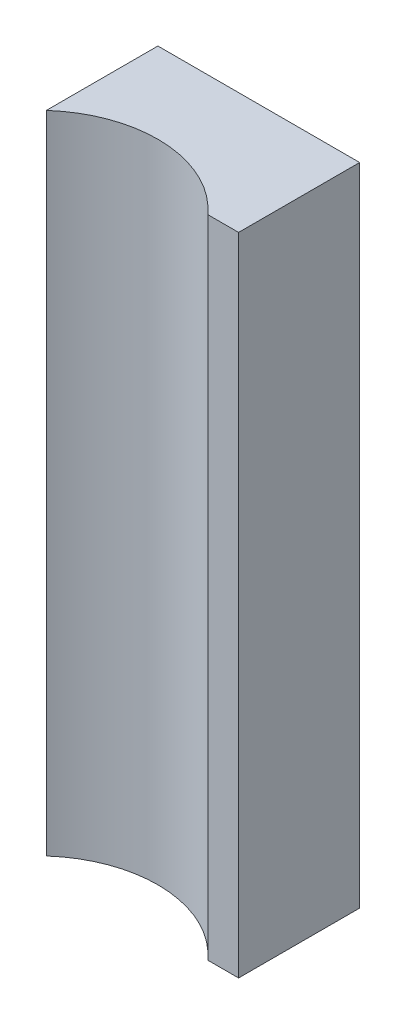
ISO-10303-21;
HEADER;
FILE_DESCRIPTION(('STEP AP214'),'2;1');
FILE_NAME('part.step','',(''),(''),'','','');
FILE_SCHEMA(('AUTOMOTIVE_DESIGN { 1 0 10303 214 1 1 1 1 }'));
ENDSEC;
DATA;
#1=APPLICATION_CONTEXT('core data for automotive mechanical design processes');
#2=APPLICATION_PROTOCOL_DEFINITION('international standard','automotive_design',2000,#1);
#3=PRODUCT_CONTEXT('',#1,'mechanical');
#4=PRODUCT('Part','Part','',(#3));
#5=PRODUCT_RELATED_PRODUCT_CATEGORY('part','',(#4));
#6=PRODUCT_DEFINITION_FORMATION('','',#4);
#7=PRODUCT_DEFINITION_CONTEXT('part definition',#1,'design');
#8=PRODUCT_DEFINITION('design','',#6,#7);
#9=PRODUCT_DEFINITION_SHAPE('','',#8);
#10=(LENGTH_UNIT() NAMED_UNIT(*) SI_UNIT(.MILLI.,.METRE.));
#11=(NAMED_UNIT(*) PLANE_ANGLE_UNIT() SI_UNIT($,.RADIAN.));
#12=(NAMED_UNIT(*) SI_UNIT($,.STERADIAN.) SOLID_ANGLE_UNIT());
#13=UNCERTAINTY_MEASURE_WITH_UNIT(LENGTH_MEASURE(1.E-05),#10,'distance_accuracy_value','');
#14=(GEOMETRIC_REPRESENTATION_CONTEXT(3) GLOBAL_UNCERTAINTY_ASSIGNED_CONTEXT((#13)) GLOBAL_UNIT_ASSIGNED_CONTEXT((#10,
#11,#12)) REPRESENTATION_CONTEXT('',''));
#15=CARTESIAN_POINT('',(0.,0.,0.));
#16=DIRECTION('',(0.,0.,1.));
#17=DIRECTION('',(1.,0.,0.));
#18=AXIS2_PLACEMENT_3D('',#15,#16,#17);
#19=CARTESIAN_POINT('',(19.05,101.6,-31.75));
#20=DIRECTION('',(0.,0.,1.));
#21=DIRECTION('',(1.,0.,0.));
#22=AXIS2_PLACEMENT_3D('',#19,#20,#21);
#23=PLANE('',#22);
#24=DIRECTION('',(-1.,0.,0.));
#25=VECTOR('',#24,1.);
#26=CARTESIAN_POINT('',(19.05,0.,-31.75));
#27=LINE('',#26,#25);
#28=CARTESIAN_POINT('',(19.05,0.,-31.75));
#29=VERTEX_POINT('',#28);
#30=CARTESIAN_POINT('',(-12.7,0.,-31.75));
#31=VERTEX_POINT('',#30);
#32=EDGE_CURVE('E127',#29,#31,#27,.T.);
#33=ORIENTED_EDGE('',*,*,#32,.T.);
#34=DIRECTION('',(0.,-1.,0.));
#35=VECTOR('',#34,1.);
#36=CARTESIAN_POINT('',(-12.7,101.6,-31.75));
#37=LINE('',#36,#35);
#38=CARTESIAN_POINT('',(-12.7,101.6,-31.75));
#39=VERTEX_POINT('',#38);
#40=EDGE_CURVE('E11',#39,#31,#37,.T.);
#41=ORIENTED_EDGE('',*,*,#40,.F.);
#42=DIRECTION('',(-1.,0.,0.));
#43=VECTOR('',#42,1.);
#44=CARTESIAN_POINT('',(19.05,101.6,-31.75));
#45=LINE('',#44,#43);
#46=CARTESIAN_POINT('',(19.05,101.6,-31.75));
#47=VERTEX_POINT('',#46);
#48=EDGE_CURVE('E139',#47,#39,#45,.T.);
#49=ORIENTED_EDGE('',*,*,#48,.F.);
#50=DIRECTION('',(0.,-1.,0.));
#51=VECTOR('',#50,1.);
#52=CARTESIAN_POINT('',(19.05,101.6,-31.75));
#53=LINE('',#52,#51);
#54=EDGE_CURVE('E123',#47,#29,#53,.T.);
#55=ORIENTED_EDGE('',*,*,#54,.T.);
#56=EDGE_LOOP('',(#33,#41,#49,#55));
#57=FACE_BOUND('',#56,.T.);
#58=ADVANCED_FACE('F39',(#57),#23,.F.);
#59=CARTESIAN_POINT('',(-12.7,101.6,-31.75));
#60=DIRECTION('',(1.,0.,0.));
#61=DIRECTION('',(0.,0.,-1.));
#62=AXIS2_PLACEMENT_3D('',#59,#60,#61);
#63=PLANE('',#62);
#64=DIRECTION('',(0.,0.,1.));
#65=VECTOR('',#64,1.);
#66=CARTESIAN_POINT('',(-12.7,0.,-31.75));
#67=LINE('',#66,#65);
#68=CARTESIAN_POINT('',(-12.7,0.,-14.1990316571237));
#69=VERTEX_POINT('',#68);
#70=EDGE_CURVE('E131',#31,#69,#67,.T.);
#71=ORIENTED_EDGE('',*,*,#70,.T.);
#72=DIRECTION('',(0.,-1.,0.));
#73=VECTOR('',#72,1.);
#74=CARTESIAN_POINT('',(-12.7,101.6,-14.1990316571237));
#75=LINE('',#74,#73);
#76=CARTESIAN_POINT('',(-12.7,101.6,-14.1990316571237));
#77=VERTEX_POINT('',#76);
#78=EDGE_CURVE('E48',#77,#69,#75,.T.);
#79=ORIENTED_EDGE('',*,*,#78,.F.);
#80=DIRECTION('',(0.,0.,1.));
#81=VECTOR('',#80,1.);
#82=CARTESIAN_POINT('',(-12.7,101.6,-31.75));
#83=LINE('',#82,#81);
#84=EDGE_CURVE('E97',#39,#77,#83,.T.);
#85=ORIENTED_EDGE('',*,*,#84,.F.);
#86=ORIENTED_EDGE('',*,*,#40,.T.);
#87=EDGE_LOOP('',(#71,#79,#85,#86));
#88=FACE_BOUND('',#87,.T.);
#89=ADVANCED_FACE('F161',(#88),#63,.F.);
#90=CARTESIAN_POINT('',(0.,101.6,0.));
#91=DIRECTION('',(0.,-1.,0.));
#92=DIRECTION('',(0.,0.,-1.));
#93=AXIS2_PLACEMENT_3D('',#90,#91,#92);
#94=CYLINDRICAL_SURFACE('',#93,19.05);
#95=CARTESIAN_POINT('',(0.,0.,0.));
#96=DIRECTION('',(0.,-1.,0.));
#97=DIRECTION('',(0.,0.,1.));
#98=AXIS2_PLACEMENT_3D('',#95,#96,#97);
#99=CIRCLE('',#98,19.05);
#100=CARTESIAN_POINT('',(14.1990316571237,0.,-12.7));
#101=VERTEX_POINT('',#100);
#102=EDGE_CURVE('E114',#69,#101,#99,.T.);
#103=ORIENTED_EDGE('',*,*,#102,.T.);
#104=DIRECTION('',(0.,-1.,0.));
#105=VECTOR('',#104,1.);
#106=CARTESIAN_POINT('',(14.1990316571237,101.6,-12.7));
#107=LINE('',#106,#105);
#108=CARTESIAN_POINT('',(14.1990316571237,101.6,-12.7));
#109=VERTEX_POINT('',#108);
#110=EDGE_CURVE('E111',#109,#101,#107,.T.);
#111=ORIENTED_EDGE('',*,*,#110,.F.);
#112=CARTESIAN_POINT('',(0.,101.6,0.));
#113=DIRECTION('',(0.,-1.,0.));
#114=DIRECTION('',(0.,0.,1.));
#115=AXIS2_PLACEMENT_3D('',#112,#113,#114);
#116=CIRCLE('',#115,19.05);
#117=EDGE_CURVE('E102',#77,#109,#116,.T.);
#118=ORIENTED_EDGE('',*,*,#117,.F.);
#119=ORIENTED_EDGE('',*,*,#78,.T.);
#120=EDGE_LOOP('',(#103,#111,#118,#119));
#121=FACE_BOUND('',#120,.T.);
#122=ADVANCED_FACE('F112',(#121),#94,.F.);
#123=CARTESIAN_POINT('',(14.1990316571237,101.6,-12.7));
#124=DIRECTION('',(0.,0.,-1.));
#125=DIRECTION('',(-1.,0.,0.));
#126=AXIS2_PLACEMENT_3D('',#123,#124,#125);
#127=PLANE('',#126);
#128=DIRECTION('',(1.,0.,0.));
#129=VECTOR('',#128,1.);
#130=CARTESIAN_POINT('',(14.1990316571237,0.,-12.7));
#131=LINE('',#130,#129);
#132=CARTESIAN_POINT('',(19.05,0.,-12.7));
#133=VERTEX_POINT('',#132);
#134=EDGE_CURVE('E82',#101,#133,#131,.T.);
#135=ORIENTED_EDGE('',*,*,#134,.T.);
#136=DIRECTION('',(0.,-1.,0.));
#137=VECTOR('',#136,1.);
#138=CARTESIAN_POINT('',(19.05,101.6,-12.7));
#139=LINE('',#138,#137);
#140=CARTESIAN_POINT('',(19.05,101.6,-12.7));
#141=VERTEX_POINT('',#140);
#142=EDGE_CURVE('E116',#141,#133,#139,.T.);
#143=ORIENTED_EDGE('',*,*,#142,.F.);
#144=DIRECTION('',(1.,0.,0.));
#145=VECTOR('',#144,1.);
#146=CARTESIAN_POINT('',(14.1990316571237,101.6,-12.7));
#147=LINE('',#146,#145);
#148=EDGE_CURVE('E106',#109,#141,#147,.T.);
#149=ORIENTED_EDGE('',*,*,#148,.F.);
#150=ORIENTED_EDGE('',*,*,#110,.T.);
#151=EDGE_LOOP('',(#135,#143,#149,#150));
#152=FACE_BOUND('',#151,.T.);
#153=ADVANCED_FACE('F118',(#152),#127,.F.);
#154=CARTESIAN_POINT('',(19.05,101.6,-12.7));
#155=DIRECTION('',(-1.,0.,0.));
#156=DIRECTION('',(0.,0.,1.));
#157=AXIS2_PLACEMENT_3D('',#154,#155,#156);
#158=PLANE('',#157);
#159=DIRECTION('',(0.,0.,-1.));
#160=VECTOR('',#159,1.);
#161=CARTESIAN_POINT('',(19.05,0.,-12.7));
#162=LINE('',#161,#160);
#163=EDGE_CURVE('E88',#133,#29,#162,.T.);
#164=ORIENTED_EDGE('',*,*,#163,.T.);
#165=ORIENTED_EDGE('',*,*,#54,.F.);
#166=DIRECTION('',(0.,0.,-1.));
#167=VECTOR('',#166,1.);
#168=CARTESIAN_POINT('',(19.05,101.6,-12.7));
#169=LINE('',#168,#167);
#170=EDGE_CURVE('E56',#141,#47,#169,.T.);
#171=ORIENTED_EDGE('',*,*,#170,.F.);
#172=ORIENTED_EDGE('',*,*,#142,.T.);
#173=EDGE_LOOP('',(#164,#165,#171,#172));
#174=FACE_BOUND('',#173,.T.);
#175=ADVANCED_FACE('F150',(#174),#158,.F.);
#176=CARTESIAN_POINT('',(0.,101.6,0.));
#177=DIRECTION('',(0.,1.,0.));
#178=DIRECTION('',(0.,0.,1.));
#179=AXIS2_PLACEMENT_3D('',#176,#177,#178);
#180=PLANE('',#179);
#181=ORIENTED_EDGE('',*,*,#48,.T.);
#182=ORIENTED_EDGE('',*,*,#84,.T.);
#183=ORIENTED_EDGE('',*,*,#117,.T.);
#184=ORIENTED_EDGE('',*,*,#148,.T.);
#185=ORIENTED_EDGE('',*,*,#170,.T.);
#186=EDGE_LOOP('',(#181,#182,#183,#184,#185));
#187=FACE_BOUND('',#186,.T.);
#188=ADVANCED_FACE('F104',(#187),#180,.T.);
#189=CARTESIAN_POINT('',(0.,0.,0.));
#190=DIRECTION('',(0.,1.,0.));
#191=DIRECTION('',(0.,0.,1.));
#192=AXIS2_PLACEMENT_3D('',#189,#190,#191);
#193=PLANE('',#192);
#194=ORIENTED_EDGE('',*,*,#32,.F.);
#195=ORIENTED_EDGE('',*,*,#163,.F.);
#196=ORIENTED_EDGE('',*,*,#134,.F.);
#197=ORIENTED_EDGE('',*,*,#102,.F.);
#198=ORIENTED_EDGE('',*,*,#70,.F.);
#199=EDGE_LOOP('',(#194,#195,#196,#197,#198));
#200=FACE_BOUND('',#199,.T.);
#201=ADVANCED_FACE('F146',(#200),#193,.F.);
#202=CLOSED_SHELL('',(#58,#89,#122,#153,#175,#188,#201));
#203=MANIFOLD_SOLID_BREP('B2',#202);
#204=ADVANCED_BREP_SHAPE_REPRESENTATION('',(#18,#203),#14);
#205=SHAPE_DEFINITION_REPRESENTATION(#9,#204);
ENDSEC;
END-ISO-10303-21;
